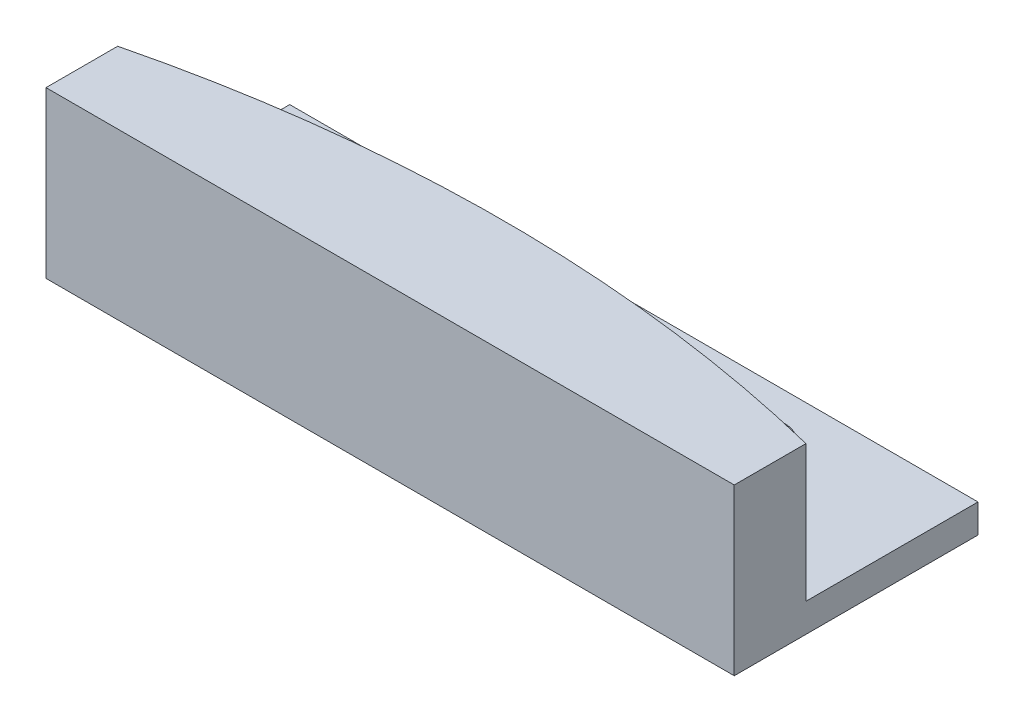
ISO-10303-21;
HEADER;
FILE_DESCRIPTION(('STEP AP214'),'2;1');
FILE_NAME('part.step','',(''),(''),'','','');
FILE_SCHEMA(('AUTOMOTIVE_DESIGN { 1 0 10303 214 1 1 1 1 }'));
ENDSEC;
DATA;
#1=APPLICATION_CONTEXT('core data for automotive mechanical design processes');
#2=APPLICATION_PROTOCOL_DEFINITION('international standard','automotive_design',2000,#1);
#3=PRODUCT_CONTEXT('',#1,'mechanical');
#4=PRODUCT('Part','Part','',(#3));
#5=PRODUCT_RELATED_PRODUCT_CATEGORY('part','',(#4));
#6=PRODUCT_DEFINITION_FORMATION('','',#4);
#7=PRODUCT_DEFINITION_CONTEXT('part definition',#1,'design');
#8=PRODUCT_DEFINITION('design','',#6,#7);
#9=PRODUCT_DEFINITION_SHAPE('','',#8);
#10=(LENGTH_UNIT() NAMED_UNIT(*) SI_UNIT(.MILLI.,.METRE.));
#11=(NAMED_UNIT(*) PLANE_ANGLE_UNIT() SI_UNIT($,.RADIAN.));
#12=(NAMED_UNIT(*) SI_UNIT($,.STERADIAN.) SOLID_ANGLE_UNIT());
#13=UNCERTAINTY_MEASURE_WITH_UNIT(LENGTH_MEASURE(1.E-05),#10,'distance_accuracy_value','');
#14=(GEOMETRIC_REPRESENTATION_CONTEXT(3) GLOBAL_UNCERTAINTY_ASSIGNED_CONTEXT((#13)) GLOBAL_UNIT_ASSIGNED_CONTEXT((#10,
#11,#12)) REPRESENTATION_CONTEXT('',''));
#15=CARTESIAN_POINT('',(0.,0.,0.));
#16=DIRECTION('',(0.,0.,1.));
#17=DIRECTION('',(1.,0.,0.));
#18=AXIS2_PLACEMENT_3D('',#15,#16,#17);
#19=CARTESIAN_POINT('',(0.,11.525,92.0772887960928));
#20=DIRECTION('',(0.,-1.,0.));
#21=DIRECTION('',(0.,0.,-1.));
#22=AXIS2_PLACEMENT_3D('',#19,#20,#21);
#23=CYLINDRICAL_SURFACE('',#22,100.);
#24=CARTESIAN_POINT('',(0.,2.,92.0772887960928));
#25=DIRECTION('',(0.,1.,0.));
#26=DIRECTION('',(0.,0.,1.));
#27=AXIS2_PLACEMENT_3D('',#24,#25,#26);
#28=CIRCLE('',#27,100.);
#29=CARTESIAN_POINT('',(-24.,2.,-5.));
#30=VERTEX_POINT('',#29);
#31=CARTESIAN_POINT('',(24.,2.,-5.00000000000001));
#32=VERTEX_POINT('',#31);
#33=EDGE_CURVE('E167',#30,#32,#28,.F.);
#34=ORIENTED_EDGE('',*,*,#33,.F.);
#35=DIRECTION('',(0.,-1.,0.));
#36=VECTOR('',#35,1.);
#37=CARTESIAN_POINT('',(-24.,11.525,-5.));
#38=LINE('',#37,#36);
#39=CARTESIAN_POINT('',(-24.,11.525,-5.));
#40=VERTEX_POINT('',#39);
#41=EDGE_CURVE('E11',#40,#30,#38,.T.);
#42=ORIENTED_EDGE('',*,*,#41,.F.);
#43=CARTESIAN_POINT('',(0.,11.525,92.0772887960928));
#44=DIRECTION('',(0.,1.,0.));
#45=DIRECTION('',(0.,0.,1.));
#46=AXIS2_PLACEMENT_3D('',#43,#44,#45);
#47=CIRCLE('',#46,100.);
#48=CARTESIAN_POINT('',(24.,11.525,-5.00000000000001));
#49=VERTEX_POINT('',#48);
#50=EDGE_CURVE('E106',#40,#49,#47,.F.);
#51=ORIENTED_EDGE('',*,*,#50,.T.);
#52=DIRECTION('',(0.,-1.,0.));
#53=VECTOR('',#52,1.);
#54=CARTESIAN_POINT('',(24.,11.525,-5.00000000000001));
#55=LINE('',#54,#53);
#56=EDGE_CURVE('E119',#49,#32,#55,.T.);
#57=ORIENTED_EDGE('',*,*,#56,.T.);
#58=EDGE_LOOP('',(#34,#42,#51,#57));
#59=FACE_BOUND('',#58,.T.);
#60=ADVANCED_FACE('F45',(#59),#23,.T.);
#61=CARTESIAN_POINT('',(-24.,11.525,0.));
#62=DIRECTION('',(1.,0.,0.));
#63=DIRECTION('',(0.,0.,-1.));
#64=AXIS2_PLACEMENT_3D('',#61,#62,#63);
#65=PLANE('',#64);
#66=DIRECTION('',(0.,0.,1.));
#67=VECTOR('',#66,1.);
#68=CARTESIAN_POINT('',(-24.,0.,0.));
#69=LINE('',#68,#67);
#70=CARTESIAN_POINT('',(-24.,0.,-17.));
#71=VERTEX_POINT('',#70);
#72=CARTESIAN_POINT('',(-24.,0.,0.));
#73=VERTEX_POINT('',#72);
#74=EDGE_CURVE('E74',#71,#73,#69,.T.);
#75=ORIENTED_EDGE('',*,*,#74,.T.);
#76=DIRECTION('',(0.,-1.,0.));
#77=VECTOR('',#76,1.);
#78=CARTESIAN_POINT('',(-24.,11.525,0.));
#79=LINE('',#78,#77);
#80=CARTESIAN_POINT('',(-24.,11.525,0.));
#81=VERTEX_POINT('',#80);
#82=EDGE_CURVE('E54',#81,#73,#79,.T.);
#83=ORIENTED_EDGE('',*,*,#82,.F.);
#84=DIRECTION('',(0.,0.,1.));
#85=VECTOR('',#84,1.);
#86=CARTESIAN_POINT('',(-24.,11.525,0.));
#87=LINE('',#86,#85);
#88=EDGE_CURVE('E100',#40,#81,#87,.T.);
#89=ORIENTED_EDGE('',*,*,#88,.F.);
#90=ORIENTED_EDGE('',*,*,#41,.T.);
#91=DIRECTION('',(0.,0.,-1.));
#92=VECTOR('',#91,1.);
#93=CARTESIAN_POINT('',(-24.,2.,0.));
#94=LINE('',#93,#92);
#95=CARTESIAN_POINT('',(-24.,2.,-17.));
#96=VERTEX_POINT('',#95);
#97=EDGE_CURVE('E159',#30,#96,#94,.T.);
#98=ORIENTED_EDGE('',*,*,#97,.T.);
#99=DIRECTION('',(0.,-1.,0.));
#100=VECTOR('',#99,1.);
#101=CARTESIAN_POINT('',(-24.,2.,-17.));
#102=LINE('',#101,#100);
#103=EDGE_CURVE('E84',#96,#71,#102,.T.);
#104=ORIENTED_EDGE('',*,*,#103,.T.);
#105=EDGE_LOOP('',(#75,#83,#89,#90,#98,#104));
#106=FACE_BOUND('',#105,.T.);
#107=ADVANCED_FACE('F109',(#106),#65,.F.);
#108=CARTESIAN_POINT('',(0.,11.525,0.));
#109=DIRECTION('',(0.,0.,-1.));
#110=DIRECTION('',(-1.,0.,0.));
#111=AXIS2_PLACEMENT_3D('',#108,#109,#110);
#112=PLANE('',#111);
#113=DIRECTION('',(1.,0.,0.));
#114=VECTOR('',#113,1.);
#115=CARTESIAN_POINT('',(0.,0.,0.));
#116=LINE('',#115,#114);
#117=CARTESIAN_POINT('',(24.,0.,0.));
#118=VERTEX_POINT('',#117);
#119=EDGE_CURVE('E125',#73,#118,#116,.T.);
#120=ORIENTED_EDGE('',*,*,#119,.T.);
#121=DIRECTION('',(0.,-1.,0.));
#122=VECTOR('',#121,1.);
#123=CARTESIAN_POINT('',(24.,11.525,0.));
#124=LINE('',#123,#122);
#125=CARTESIAN_POINT('',(24.,11.525,0.));
#126=VERTEX_POINT('',#125);
#127=EDGE_CURVE('E113',#126,#118,#124,.T.);
#128=ORIENTED_EDGE('',*,*,#127,.F.);
#129=DIRECTION('',(1.,0.,0.));
#130=VECTOR('',#129,1.);
#131=CARTESIAN_POINT('',(0.,11.525,0.));
#132=LINE('',#131,#130);
#133=EDGE_CURVE('E103',#81,#126,#132,.T.);
#134=ORIENTED_EDGE('',*,*,#133,.F.);
#135=ORIENTED_EDGE('',*,*,#82,.T.);
#136=EDGE_LOOP('',(#120,#128,#134,#135));
#137=FACE_BOUND('',#136,.T.);
#138=ADVANCED_FACE('F114',(#137),#112,.F.);
#139=CARTESIAN_POINT('',(24.,11.525,0.));
#140=DIRECTION('',(-1.,0.,0.));
#141=DIRECTION('',(0.,0.,1.));
#142=AXIS2_PLACEMENT_3D('',#139,#140,#141);
#143=PLANE('',#142);
#144=DIRECTION('',(0.,0.,-1.));
#145=VECTOR('',#144,1.);
#146=CARTESIAN_POINT('',(24.,0.,0.));
#147=LINE('',#146,#145);
#148=CARTESIAN_POINT('',(24.,0.,-17.));
#149=VERTEX_POINT('',#148);
#150=EDGE_CURVE('E129',#118,#149,#147,.T.);
#151=ORIENTED_EDGE('',*,*,#150,.T.);
#152=DIRECTION('',(0.,-1.,0.));
#153=VECTOR('',#152,1.);
#154=CARTESIAN_POINT('',(24.,2.,-17.));
#155=LINE('',#154,#153);
#156=CARTESIAN_POINT('',(24.,2.,-17.));
#157=VERTEX_POINT('',#156);
#158=EDGE_CURVE('E126',#157,#149,#155,.T.);
#159=ORIENTED_EDGE('',*,*,#158,.F.);
#160=DIRECTION('',(0.,0.,1.));
#161=VECTOR('',#160,1.);
#162=CARTESIAN_POINT('',(24.,2.,0.));
#163=LINE('',#162,#161);
#164=EDGE_CURVE('E176',#157,#32,#163,.T.);
#165=ORIENTED_EDGE('',*,*,#164,.T.);
#166=ORIENTED_EDGE('',*,*,#56,.F.);
#167=DIRECTION('',(0.,0.,-1.));
#168=VECTOR('',#167,1.);
#169=CARTESIAN_POINT('',(24.,11.525,0.));
#170=LINE('',#169,#168);
#171=EDGE_CURVE('E62',#126,#49,#170,.T.);
#172=ORIENTED_EDGE('',*,*,#171,.F.);
#173=ORIENTED_EDGE('',*,*,#127,.T.);
#174=EDGE_LOOP('',(#151,#159,#165,#166,#172,#173));
#175=FACE_BOUND('',#174,.T.);
#176=ADVANCED_FACE('F138',(#175),#143,.F.);
#177=CARTESIAN_POINT('',(0.,11.525,0.));
#178=DIRECTION('',(0.,1.,0.));
#179=DIRECTION('',(0.,0.,1.));
#180=AXIS2_PLACEMENT_3D('',#177,#178,#179);
#181=PLANE('',#180);
#182=ORIENTED_EDGE('',*,*,#50,.F.);
#183=ORIENTED_EDGE('',*,*,#88,.T.);
#184=ORIENTED_EDGE('',*,*,#133,.T.);
#185=ORIENTED_EDGE('',*,*,#171,.T.);
#186=EDGE_LOOP('',(#182,#183,#184,#185));
#187=FACE_BOUND('',#186,.T.);
#188=ADVANCED_FACE('F101',(#187),#181,.T.);
#189=CARTESIAN_POINT('',(0.,0.,0.));
#190=DIRECTION('',(0.,1.,0.));
#191=DIRECTION('',(0.,0.,1.));
#192=AXIS2_PLACEMENT_3D('',#189,#190,#191);
#193=PLANE('',#192);
#194=ORIENTED_EDGE('',*,*,#74,.F.);
#195=DIRECTION('',(1.,0.,0.));
#196=VECTOR('',#195,1.);
#197=CARTESIAN_POINT('',(0.,0.,-17.));
#198=LINE('',#197,#196);
#199=EDGE_CURVE('E144',#71,#149,#198,.T.);
#200=ORIENTED_EDGE('',*,*,#199,.T.);
#201=ORIENTED_EDGE('',*,*,#150,.F.);
#202=ORIENTED_EDGE('',*,*,#119,.F.);
#203=EDGE_LOOP('',(#194,#200,#201,#202));
#204=FACE_BOUND('',#203,.T.);
#205=CARTESIAN_POINT('',(-12.5,0.,-13.));
#206=DIRECTION('',(0.,1.,0.));
#207=DIRECTION('',(0.,0.,1.));
#208=AXIS2_PLACEMENT_3D('',#205,#206,#207);
#209=CIRCLE('',#208,2.);
#210=CARTESIAN_POINT('',(-12.5,0.,-11.));
#211=VERTEX_POINT('',#210);
#212=EDGE_CURVE('E146',#211,#211,#209,.T.);
#213=ORIENTED_EDGE('',*,*,#212,.T.);
#214=EDGE_LOOP('',(#213));
#215=FACE_BOUND('',#214,.T.);
#216=CARTESIAN_POINT('',(12.5,0.,-13.));
#217=DIRECTION('',(0.,1.,0.));
#218=DIRECTION('',(0.,0.,1.));
#219=AXIS2_PLACEMENT_3D('',#216,#217,#218);
#220=CIRCLE('',#219,2.);
#221=CARTESIAN_POINT('',(12.5,0.,-11.));
#222=VERTEX_POINT('',#221);
#223=EDGE_CURVE('E150',#222,#222,#220,.F.);
#224=ORIENTED_EDGE('',*,*,#223,.F.);
#225=EDGE_LOOP('',(#224));
#226=FACE_BOUND('',#225,.T.);
#227=ADVANCED_FACE('F142',(#204,#215,#226),#193,.F.);
#228=CARTESIAN_POINT('',(-12.5,2.,-13.));
#229=DIRECTION('',(0.,-1.,0.));
#230=DIRECTION('',(0.,0.,-1.));
#231=AXIS2_PLACEMENT_3D('',#228,#229,#230);
#232=CYLINDRICAL_SURFACE('',#231,2.);
#233=CARTESIAN_POINT('',(-12.5,2.,-13.));
#234=DIRECTION('',(0.,1.,0.));
#235=DIRECTION('',(0.,0.,1.));
#236=AXIS2_PLACEMENT_3D('',#233,#234,#235);
#237=CIRCLE('',#236,2.);
#238=CARTESIAN_POINT('',(-12.5,2.,-11.));
#239=VERTEX_POINT('',#238);
#240=EDGE_CURVE('E183',#239,#239,#237,.T.);
#241=ORIENTED_EDGE('',*,*,#240,.T.);
#242=EDGE_LOOP('',(#241));
#243=FACE_BOUND('',#242,.T.);
#244=ORIENTED_EDGE('',*,*,#212,.F.);
#245=EDGE_LOOP('',(#244));
#246=FACE_BOUND('',#245,.T.);
#247=ADVANCED_FACE('F203',(#243,#246),#232,.F.);
#248=CARTESIAN_POINT('',(0.,2.,-17.));
#249=DIRECTION('',(0.,0.,-1.));
#250=DIRECTION('',(-1.,0.,0.));
#251=AXIS2_PLACEMENT_3D('',#248,#249,#250);
#252=PLANE('',#251);
#253=ORIENTED_EDGE('',*,*,#199,.F.);
#254=ORIENTED_EDGE('',*,*,#103,.F.);
#255=DIRECTION('',(1.,0.,0.));
#256=VECTOR('',#255,1.);
#257=CARTESIAN_POINT('',(0.,2.,-17.));
#258=LINE('',#257,#256);
#259=EDGE_CURVE('E180',#96,#157,#258,.T.);
#260=ORIENTED_EDGE('',*,*,#259,.T.);
#261=ORIENTED_EDGE('',*,*,#158,.T.);
#262=EDGE_LOOP('',(#253,#254,#260,#261));
#263=FACE_BOUND('',#262,.T.);
#264=ADVANCED_FACE('F198',(#263),#252,.T.);
#265=CARTESIAN_POINT('',(12.5,2.,-13.));
#266=DIRECTION('',(0.,-1.,0.));
#267=DIRECTION('',(0.,0.,-1.));
#268=AXIS2_PLACEMENT_3D('',#265,#266,#267);
#269=CYLINDRICAL_SURFACE('',#268,2.);
#270=CARTESIAN_POINT('',(12.5,2.,-13.));
#271=DIRECTION('',(0.,1.,0.));
#272=DIRECTION('',(0.,0.,1.));
#273=AXIS2_PLACEMENT_3D('',#270,#271,#272);
#274=CIRCLE('',#273,2.);
#275=CARTESIAN_POINT('',(12.5,2.,-11.));
#276=VERTEX_POINT('',#275);
#277=EDGE_CURVE('E153',#276,#276,#274,.F.);
#278=ORIENTED_EDGE('',*,*,#277,.F.);
#279=EDGE_LOOP('',(#278));
#280=FACE_BOUND('',#279,.T.);
#281=ORIENTED_EDGE('',*,*,#223,.T.);
#282=EDGE_LOOP('',(#281));
#283=FACE_BOUND('',#282,.T.);
#284=ADVANCED_FACE('F195',(#280,#283),#269,.F.);
#285=CARTESIAN_POINT('',(0.,2.,0.));
#286=DIRECTION('',(0.,1.,0.));
#287=DIRECTION('',(0.,0.,1.));
#288=AXIS2_PLACEMENT_3D('',#285,#286,#287);
#289=PLANE('',#288);
#290=ORIENTED_EDGE('',*,*,#97,.F.);
#291=ORIENTED_EDGE('',*,*,#33,.T.);
#292=ORIENTED_EDGE('',*,*,#164,.F.);
#293=ORIENTED_EDGE('',*,*,#259,.F.);
#294=EDGE_LOOP('',(#290,#291,#292,#293));
#295=FACE_BOUND('',#294,.T.);
#296=ORIENTED_EDGE('',*,*,#240,.F.);
#297=EDGE_LOOP('',(#296));
#298=FACE_BOUND('',#297,.T.);
#299=ORIENTED_EDGE('',*,*,#277,.T.);
#300=EDGE_LOOP('',(#299));
#301=FACE_BOUND('',#300,.T.);
#302=ADVANCED_FACE('F174',(#295,#298,#301),#289,.T.);
#303=CLOSED_SHELL('',(#60,#107,#138,#176,#188,#227,#247,#264,#284,#302));
#304=MANIFOLD_SOLID_BREP('B2',#303);
#305=ADVANCED_BREP_SHAPE_REPRESENTATION('',(#18,#304),#14);
#306=SHAPE_DEFINITION_REPRESENTATION(#9,#305);
ENDSEC;
END-ISO-10303-21;
